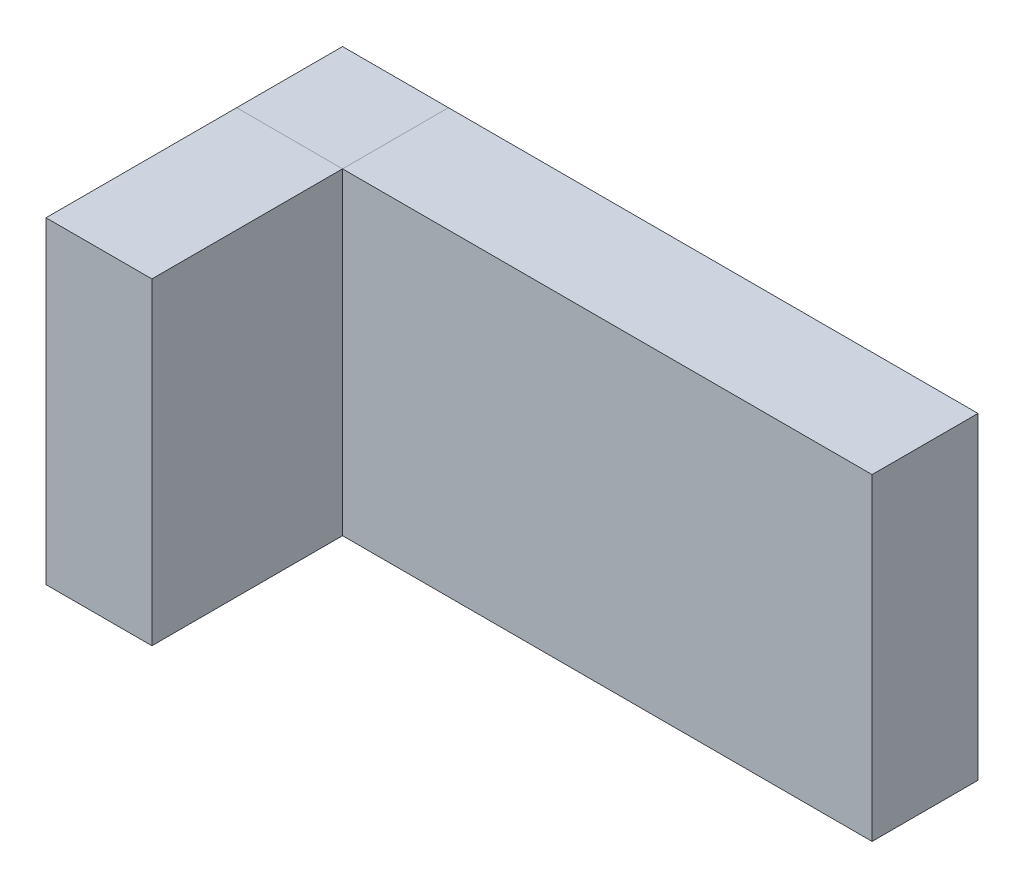
ISO-10303-21;
HEADER;
FILE_DESCRIPTION(('STEP AP214'),'2;1');
FILE_NAME('part.step','',(''),(''),'','','');
FILE_SCHEMA(('AUTOMOTIVE_DESIGN { 1 0 10303 214 1 1 1 1 }'));
ENDSEC;
DATA;
#1=APPLICATION_CONTEXT('core data for automotive mechanical design processes');
#2=APPLICATION_PROTOCOL_DEFINITION('international standard','automotive_design',2000,#1);
#3=PRODUCT_CONTEXT('',#1,'mechanical');
#4=PRODUCT('Part','Part','',(#3));
#5=PRODUCT_RELATED_PRODUCT_CATEGORY('part','',(#4));
#6=PRODUCT_DEFINITION_FORMATION('','',#4);
#7=PRODUCT_DEFINITION_CONTEXT('part definition',#1,'design');
#8=PRODUCT_DEFINITION('design','',#6,#7);
#9=PRODUCT_DEFINITION_SHAPE('','',#8);
#10=(LENGTH_UNIT() NAMED_UNIT(*) SI_UNIT(.MILLI.,.METRE.));
#11=(NAMED_UNIT(*) PLANE_ANGLE_UNIT() SI_UNIT($,.RADIAN.));
#12=(NAMED_UNIT(*) SI_UNIT($,.STERADIAN.) SOLID_ANGLE_UNIT());
#13=UNCERTAINTY_MEASURE_WITH_UNIT(LENGTH_MEASURE(1.E-05),#10,'distance_accuracy_value','');
#14=(GEOMETRIC_REPRESENTATION_CONTEXT(3) GLOBAL_UNCERTAINTY_ASSIGNED_CONTEXT((#13)) GLOBAL_UNIT_ASSIGNED_CONTEXT((#10,
#11,#12)) REPRESENTATION_CONTEXT('',''));
#15=CARTESIAN_POINT('',(0.,0.,0.));
#16=DIRECTION('',(0.,0.,1.));
#17=DIRECTION('',(1.,0.,0.));
#18=AXIS2_PLACEMENT_3D('',#15,#16,#17);
#19=CARTESIAN_POINT('',(41.528299774814,24.007119065206,0.));
#20=DIRECTION('',(1.,8.74227764510096E-08,0.));
#21=DIRECTION('',(0.,2.5398942236687E-09,-1.));
#22=AXIS2_PLACEMENT_3D('',#19,#20,#21);
#23=PLANE('',#22);
#24=DIRECTION('',(-8.74227764510096E-08,1.,0.));
#25=VECTOR('',#24,1.);
#26=CARTESIAN_POINT('',(41.528299774814,24.007119065206,0.28));
#27=LINE('',#26,#25);
#28=CARTESIAN_POINT('',(41.528299774814,24.007119065206,0.28));
#29=VERTEX_POINT('',#28);
#30=CARTESIAN_POINT('',(41.528299748587,24.307119065206,0.28));
#31=VERTEX_POINT('',#30);
#32=EDGE_CURVE('E11',#29,#31,#27,.T.);
#33=ORIENTED_EDGE('',*,*,#32,.T.);
#34=DIRECTION('',(0.,0.,-1.));
#35=VECTOR('',#34,1.);
#36=CARTESIAN_POINT('',(41.528299748587,24.307119065206,0.28));
#37=LINE('',#36,#35);
#38=CARTESIAN_POINT('',(41.528299748587,24.307119065206,0.1));
#39=VERTEX_POINT('',#38);
#40=EDGE_CURVE('E159',#31,#39,#37,.T.);
#41=ORIENTED_EDGE('',*,*,#40,.T.);
#42=DIRECTION('',(8.74227764510096E-08,-1.,0.));
#43=VECTOR('',#42,1.);
#44=CARTESIAN_POINT('',(41.528299748587,24.307119065206,0.1));
#45=LINE('',#44,#43);
#46=CARTESIAN_POINT('',(41.528299774814,24.007119065206,0.1));
#47=VERTEX_POINT('',#46);
#48=EDGE_CURVE('E171',#39,#47,#45,.T.);
#49=ORIENTED_EDGE('',*,*,#48,.T.);
#50=DIRECTION('',(0.,0.,1.));
#51=VECTOR('',#50,1.);
#52=CARTESIAN_POINT('',(41.528299774814,24.007119065206,0.));
#53=LINE('',#52,#51);
#54=EDGE_CURVE('E117',#47,#29,#53,.T.);
#55=ORIENTED_EDGE('',*,*,#54,.T.);
#56=EDGE_LOOP('',(#33,#41,#49,#55));
#57=FACE_BOUND('',#56,.T.);
#58=ADVANCED_FACE('F16',(#57),#23,.F.);
#59=CARTESIAN_POINT('',(41.628299774814,24.007119073948,0.28));
#60=DIRECTION('',(0.,0.,-1.));
#61=DIRECTION('',(0.,-1.,0.));
#62=AXIS2_PLACEMENT_3D('',#59,#60,#61);
#63=PLANE('',#62);
#64=DIRECTION('',(-8.74227764510096E-08,1.,0.));
#65=VECTOR('',#64,1.);
#66=CARTESIAN_POINT('',(41.628299774814,24.007119073948,0.28));
#67=LINE('',#66,#65);
#68=CARTESIAN_POINT('',(41.628299774814,24.007119073948,0.28));
#69=VERTEX_POINT('',#68);
#70=CARTESIAN_POINT('',(41.628299748587,24.307119073948,0.28));
#71=VERTEX_POINT('',#70);
#72=EDGE_CURVE('E106',#69,#71,#67,.T.);
#73=ORIENTED_EDGE('',*,*,#72,.T.);
#74=DIRECTION('',(-1.,-8.74227764510096E-08,0.));
#75=VECTOR('',#74,1.);
#76=CARTESIAN_POINT('',(41.628299748587,24.307119073948,0.28));
#77=LINE('',#76,#75);
#78=EDGE_CURVE('E27',#71,#31,#77,.T.);
#79=ORIENTED_EDGE('',*,*,#78,.T.);
#80=ORIENTED_EDGE('',*,*,#32,.F.);
#81=DIRECTION('',(-1.,-8.74227764510096E-08,0.));
#82=VECTOR('',#81,1.);
#83=CARTESIAN_POINT('',(41.628299774814,24.007119073948,0.28));
#84=LINE('',#83,#82);
#85=EDGE_CURVE('E186',#69,#29,#84,.T.);
#86=ORIENTED_EDGE('',*,*,#85,.F.);
#87=EDGE_LOOP('',(#73,#79,#80,#86));
#88=FACE_BOUND('',#87,.T.);
#89=ADVANCED_FACE('F328',(#88),#63,.F.);
#90=CARTESIAN_POINT('',(41.628299748587,24.307119073948,0.28));
#91=DIRECTION('',(8.74227764510096E-08,-1.,0.));
#92=DIRECTION('',(0.,0.,-1.));
#93=AXIS2_PLACEMENT_3D('',#90,#91,#92);
#94=PLANE('',#93);
#95=DIRECTION('',(-1.,-8.74227764510096E-08,0.));
#96=VECTOR('',#95,1.);
#97=CARTESIAN_POINT('',(42.128299748587,24.307119117659,0.1));
#98=LINE('',#97,#96);
#99=CARTESIAN_POINT('',(41.628299748587,24.307119073948,0.1));
#100=VERTEX_POINT('',#99);
#101=EDGE_CURVE('E195',#100,#39,#98,.T.);
#102=ORIENTED_EDGE('',*,*,#101,.T.);
#103=ORIENTED_EDGE('',*,*,#40,.F.);
#104=ORIENTED_EDGE('',*,*,#78,.F.);
#105=DIRECTION('',(0.,0.,-1.));
#106=VECTOR('',#105,1.);
#107=CARTESIAN_POINT('',(41.628299748587,24.307119073948,0.28));
#108=LINE('',#107,#106);
#109=EDGE_CURVE('E110',#71,#100,#108,.T.);
#110=ORIENTED_EDGE('',*,*,#109,.T.);
#111=EDGE_LOOP('',(#102,#103,#104,#110));
#112=FACE_BOUND('',#111,.T.);
#113=ADVANCED_FACE('F333',(#112),#94,.F.);
#114=CARTESIAN_POINT('',(41.528299748587,24.307119065206,0.));
#115=DIRECTION('',(1.,8.74227764510096E-08,0.));
#116=DIRECTION('',(0.,0.,-1.));
#117=AXIS2_PLACEMENT_3D('',#114,#115,#116);
#118=PLANE('',#117);
#119=DIRECTION('',(8.74227764510096E-08,-1.,0.));
#120=VECTOR('',#119,1.);
#121=CARTESIAN_POINT('',(41.528299748587,24.307119065206,0.));
#122=LINE('',#121,#120);
#123=CARTESIAN_POINT('',(41.528299748587,24.307119065206,0.));
#124=VERTEX_POINT('',#123);
#125=CARTESIAN_POINT('',(41.528299774814,24.007119065206,0.));
#126=VERTEX_POINT('',#125);
#127=EDGE_CURVE('E111',#124,#126,#122,.T.);
#128=ORIENTED_EDGE('',*,*,#127,.T.);
#129=DIRECTION('',(0.,0.,1.));
#130=VECTOR('',#129,1.);
#131=CARTESIAN_POINT('',(41.528299774814,24.007119065206,0.));
#132=LINE('',#131,#130);
#133=EDGE_CURVE('E123',#126,#47,#132,.T.);
#134=ORIENTED_EDGE('',*,*,#133,.T.);
#135=ORIENTED_EDGE('',*,*,#48,.F.);
#136=DIRECTION('',(0.,0.,1.));
#137=VECTOR('',#136,1.);
#138=CARTESIAN_POINT('',(41.528299748587,24.307119065206,0.));
#139=LINE('',#138,#137);
#140=EDGE_CURVE('E197',#124,#39,#139,.T.);
#141=ORIENTED_EDGE('',*,*,#140,.F.);
#142=EDGE_LOOP('',(#128,#134,#135,#141));
#143=FACE_BOUND('',#142,.T.);
#144=ADVANCED_FACE('F340',(#143),#118,.F.);
#145=CARTESIAN_POINT('',(41.628299774814,24.007119073948,0.));
#146=DIRECTION('',(-8.74227764510096E-08,1.,0.));
#147=DIRECTION('',(0.,0.,1.));
#148=AXIS2_PLACEMENT_3D('',#145,#146,#147);
#149=PLANE('',#148);
#150=ORIENTED_EDGE('',*,*,#85,.T.);
#151=ORIENTED_EDGE('',*,*,#54,.F.);
#152=DIRECTION('',(1.,8.74227764510096E-08,0.));
#153=VECTOR('',#152,1.);
#154=CARTESIAN_POINT('',(41.528299774814,24.007119065206,0.1));
#155=LINE('',#154,#153);
#156=CARTESIAN_POINT('',(41.628299774814,24.007119073948,0.1));
#157=VERTEX_POINT('',#156);
#158=EDGE_CURVE('E115',#47,#157,#155,.T.);
#159=ORIENTED_EDGE('',*,*,#158,.T.);
#160=DIRECTION('',(0.,0.,1.));
#161=VECTOR('',#160,1.);
#162=CARTESIAN_POINT('',(41.628299774814,24.007119073948,0.));
#163=LINE('',#162,#161);
#164=EDGE_CURVE('E98',#157,#69,#163,.T.);
#165=ORIENTED_EDGE('',*,*,#164,.T.);
#166=EDGE_LOOP('',(#150,#151,#159,#165));
#167=FACE_BOUND('',#166,.T.);
#168=ADVANCED_FACE('F116',(#167),#149,.F.);
#169=CARTESIAN_POINT('',(41.628299774814,24.007119073948,0.));
#170=DIRECTION('',(1.,8.74227764510096E-08,0.));
#171=DIRECTION('',(0.,2.5398942236687E-09,-1.));
#172=AXIS2_PLACEMENT_3D('',#169,#170,#171);
#173=PLANE('',#172);
#174=ORIENTED_EDGE('',*,*,#164,.F.);
#175=DIRECTION('',(8.74227764510096E-08,-1.,0.));
#176=VECTOR('',#175,1.);
#177=CARTESIAN_POINT('',(41.628299774814,24.007119073948,0.1));
#178=LINE('',#177,#176);
#179=EDGE_CURVE('E103',#100,#157,#178,.T.);
#180=ORIENTED_EDGE('',*,*,#179,.F.);
#181=ORIENTED_EDGE('',*,*,#109,.F.);
#182=ORIENTED_EDGE('',*,*,#72,.F.);
#183=EDGE_LOOP('',(#174,#180,#181,#182));
#184=FACE_BOUND('',#183,.T.);
#185=ADVANCED_FACE('F100',(#184),#173,.T.);
#186=CARTESIAN_POINT('',(41.528299774814,24.007119065206,0.));
#187=DIRECTION('',(0.,0.,-1.));
#188=DIRECTION('',(0.,-1.,0.));
#189=AXIS2_PLACEMENT_3D('',#186,#187,#188);
#190=PLANE('',#189);
#191=DIRECTION('',(8.74227764510096E-08,-1.,0.));
#192=VECTOR('',#191,1.);
#193=CARTESIAN_POINT('',(41.628299748587,24.307119073948,0.));
#194=LINE('',#193,#192);
#195=CARTESIAN_POINT('',(41.628299748587,24.307119073948,0.));
#196=VERTEX_POINT('',#195);
#197=CARTESIAN_POINT('',(41.628299774814,24.007119073948,0.));
#198=VERTEX_POINT('',#197);
#199=EDGE_CURVE('E134',#196,#198,#194,.T.);
#200=ORIENTED_EDGE('',*,*,#199,.T.);
#201=DIRECTION('',(-1.,-8.74227764510096E-08,0.));
#202=VECTOR('',#201,1.);
#203=CARTESIAN_POINT('',(41.628299774814,24.007119073948,0.));
#204=LINE('',#203,#202);
#205=EDGE_CURVE('E140',#198,#126,#204,.T.);
#206=ORIENTED_EDGE('',*,*,#205,.T.);
#207=ORIENTED_EDGE('',*,*,#127,.F.);
#208=DIRECTION('',(-1.,-8.74227764510096E-08,0.));
#209=VECTOR('',#208,1.);
#210=CARTESIAN_POINT('',(41.628299748587,24.307119073948,0.));
#211=LINE('',#210,#209);
#212=EDGE_CURVE('E199',#196,#124,#211,.T.);
#213=ORIENTED_EDGE('',*,*,#212,.F.);
#214=EDGE_LOOP('',(#200,#206,#207,#213));
#215=FACE_BOUND('',#214,.T.);
#216=ADVANCED_FACE('F18',(#215),#190,.T.);
#217=CARTESIAN_POINT('',(41.628299748587,24.307119073948,0.28));
#218=DIRECTION('',(8.74227764510096E-08,-1.,0.));
#219=DIRECTION('',(0.,0.,-1.));
#220=AXIS2_PLACEMENT_3D('',#217,#218,#219);
#221=PLANE('',#220);
#222=ORIENTED_EDGE('',*,*,#212,.T.);
#223=ORIENTED_EDGE('',*,*,#140,.T.);
#224=ORIENTED_EDGE('',*,*,#101,.F.);
#225=DIRECTION('',(0.,0.,-1.));
#226=VECTOR('',#225,1.);
#227=CARTESIAN_POINT('',(41.628299748587,24.307119073948,0.28));
#228=LINE('',#227,#226);
#229=EDGE_CURVE('E164',#100,#196,#228,.T.);
#230=ORIENTED_EDGE('',*,*,#229,.T.);
#231=EDGE_LOOP('',(#222,#223,#224,#230));
#232=FACE_BOUND('',#231,.T.);
#233=ADVANCED_FACE('F314',(#232),#221,.F.);
#234=CARTESIAN_POINT('',(41.628299774814,24.007119073948,0.));
#235=DIRECTION('',(-8.74227764510096E-08,1.,0.));
#236=DIRECTION('',(0.,0.,1.));
#237=AXIS2_PLACEMENT_3D('',#234,#235,#236);
#238=PLANE('',#237);
#239=ORIENTED_EDGE('',*,*,#158,.F.);
#240=ORIENTED_EDGE('',*,*,#133,.F.);
#241=ORIENTED_EDGE('',*,*,#205,.F.);
#242=DIRECTION('',(0.,0.,1.));
#243=VECTOR('',#242,1.);
#244=CARTESIAN_POINT('',(41.628299774814,24.007119073948,0.));
#245=LINE('',#244,#243);
#246=EDGE_CURVE('E137',#198,#157,#245,.T.);
#247=ORIENTED_EDGE('',*,*,#246,.T.);
#248=EDGE_LOOP('',(#239,#240,#241,#247));
#249=FACE_BOUND('',#248,.T.);
#250=ADVANCED_FACE('F138',(#249),#238,.F.);
#251=CARTESIAN_POINT('',(41.528299774814,24.007119065206,0.1));
#252=DIRECTION('',(0.,0.,-1.));
#253=DIRECTION('',(0.,-1.,0.));
#254=AXIS2_PLACEMENT_3D('',#251,#252,#253);
#255=PLANE('',#254);
#256=DIRECTION('',(-8.74227764510096E-08,1.,0.));
#257=VECTOR('',#256,1.);
#258=CARTESIAN_POINT('',(42.128299774814,24.007119117659,0.1));
#259=LINE('',#258,#257);
#260=CARTESIAN_POINT('',(42.128299774814,24.007119117659,0.1));
#261=VERTEX_POINT('',#260);
#262=CARTESIAN_POINT('',(42.128299748587,24.307119117659,0.1));
#263=VERTEX_POINT('',#262);
#264=EDGE_CURVE('E20',#261,#263,#259,.T.);
#265=ORIENTED_EDGE('',*,*,#264,.T.);
#266=DIRECTION('',(-1.,-8.74227764510096E-08,0.));
#267=VECTOR('',#266,1.);
#268=CARTESIAN_POINT('',(42.128299748587,24.307119117659,0.1));
#269=LINE('',#268,#267);
#270=EDGE_CURVE('E131',#263,#100,#269,.T.);
#271=ORIENTED_EDGE('',*,*,#270,.T.);
#272=ORIENTED_EDGE('',*,*,#179,.T.);
#273=DIRECTION('',(1.,8.74227764510096E-08,0.));
#274=VECTOR('',#273,1.);
#275=CARTESIAN_POINT('',(41.528299774814,24.007119065206,0.1));
#276=LINE('',#275,#274);
#277=EDGE_CURVE('E129',#157,#261,#276,.T.);
#278=ORIENTED_EDGE('',*,*,#277,.T.);
#279=EDGE_LOOP('',(#265,#271,#272,#278));
#280=FACE_BOUND('',#279,.T.);
#281=ADVANCED_FACE('F127',(#280),#255,.F.);
#282=CARTESIAN_POINT('',(41.528299774814,24.007119065206,0.));
#283=DIRECTION('',(0.,0.,-1.));
#284=DIRECTION('',(0.,-1.,0.));
#285=AXIS2_PLACEMENT_3D('',#282,#283,#284);
#286=PLANE('',#285);
#287=DIRECTION('',(1.,8.74227764510096E-08,0.));
#288=VECTOR('',#287,1.);
#289=CARTESIAN_POINT('',(41.528299774814,24.007119065206,0.));
#290=LINE('',#289,#288);
#291=CARTESIAN_POINT('',(42.128299774814,24.007119117659,0.));
#292=VERTEX_POINT('',#291);
#293=EDGE_CURVE('E144',#198,#292,#290,.T.);
#294=ORIENTED_EDGE('',*,*,#293,.F.);
#295=ORIENTED_EDGE('',*,*,#199,.F.);
#296=DIRECTION('',(-1.,-8.74227764510096E-08,0.));
#297=VECTOR('',#296,1.);
#298=CARTESIAN_POINT('',(42.128299748587,24.307119117659,0.));
#299=LINE('',#298,#297);
#300=CARTESIAN_POINT('',(42.128299748587,24.307119117659,0.));
#301=VERTEX_POINT('',#300);
#302=EDGE_CURVE('E163',#301,#196,#299,.T.);
#303=ORIENTED_EDGE('',*,*,#302,.F.);
#304=DIRECTION('',(-8.74227764510096E-08,1.,0.));
#305=VECTOR('',#304,1.);
#306=CARTESIAN_POINT('',(42.128299774814,24.007119117659,0.));
#307=LINE('',#306,#305);
#308=EDGE_CURVE('E177',#292,#301,#307,.T.);
#309=ORIENTED_EDGE('',*,*,#308,.F.);
#310=EDGE_LOOP('',(#294,#295,#303,#309));
#311=FACE_BOUND('',#310,.T.);
#312=ADVANCED_FACE('F226',(#311),#286,.T.);
#313=CARTESIAN_POINT('',(42.128299748587,24.307119117659,0.));
#314=DIRECTION('',(8.74227764510096E-08,-1.,0.));
#315=DIRECTION('',(0.,0.,-1.));
#316=AXIS2_PLACEMENT_3D('',#313,#314,#315);
#317=PLANE('',#316);
#318=ORIENTED_EDGE('',*,*,#229,.F.);
#319=ORIENTED_EDGE('',*,*,#270,.F.);
#320=DIRECTION('',(0.,0.,1.));
#321=VECTOR('',#320,1.);
#322=CARTESIAN_POINT('',(42.128299748587,24.307119117659,0.));
#323=LINE('',#322,#321);
#324=EDGE_CURVE('E174',#301,#263,#323,.T.);
#325=ORIENTED_EDGE('',*,*,#324,.F.);
#326=ORIENTED_EDGE('',*,*,#302,.T.);
#327=EDGE_LOOP('',(#318,#319,#325,#326));
#328=FACE_BOUND('',#327,.T.);
#329=ADVANCED_FACE('F316',(#328),#317,.F.);
#330=CARTESIAN_POINT('',(41.528299774814,24.007119065206,0.));
#331=DIRECTION('',(-8.74227764510096E-08,1.,0.));
#332=DIRECTION('',(0.,0.,1.));
#333=AXIS2_PLACEMENT_3D('',#330,#331,#332);
#334=PLANE('',#333);
#335=DIRECTION('',(0.,0.,1.));
#336=VECTOR('',#335,1.);
#337=CARTESIAN_POINT('',(42.128299774814,24.007119117659,0.));
#338=LINE('',#337,#336);
#339=EDGE_CURVE('E148',#292,#261,#338,.T.);
#340=ORIENTED_EDGE('',*,*,#339,.T.);
#341=ORIENTED_EDGE('',*,*,#277,.F.);
#342=ORIENTED_EDGE('',*,*,#246,.F.);
#343=ORIENTED_EDGE('',*,*,#293,.T.);
#344=EDGE_LOOP('',(#340,#341,#342,#343));
#345=FACE_BOUND('',#344,.T.);
#346=ADVANCED_FACE('F146',(#345),#334,.F.);
#347=CARTESIAN_POINT('',(42.128299774814,24.007119117659,0.));
#348=DIRECTION('',(-1.,-8.74227764510096E-08,0.));
#349=DIRECTION('',(-8.74227764510096E-08,1.,0.));
#350=AXIS2_PLACEMENT_3D('',#347,#348,#349);
#351=PLANE('',#350);
#352=ORIENTED_EDGE('',*,*,#308,.T.);
#353=ORIENTED_EDGE('',*,*,#324,.T.);
#354=ORIENTED_EDGE('',*,*,#264,.F.);
#355=ORIENTED_EDGE('',*,*,#339,.F.);
#356=EDGE_LOOP('',(#352,#353,#354,#355));
#357=FACE_BOUND('',#356,.T.);
#358=ADVANCED_FACE('F229',(#357),#351,.F.);
#359=CLOSED_SHELL('',(#58,#89,#113,#144,#168,#185,#216,#233,#250,#281,#312,#329,#346,#358));
#360=MANIFOLD_SOLID_BREP('B1',#359);
#361=ADVANCED_BREP_SHAPE_REPRESENTATION('',(#18,#360),#14);
#362=SHAPE_DEFINITION_REPRESENTATION(#9,#361);
ENDSEC;
END-ISO-10303-21;
